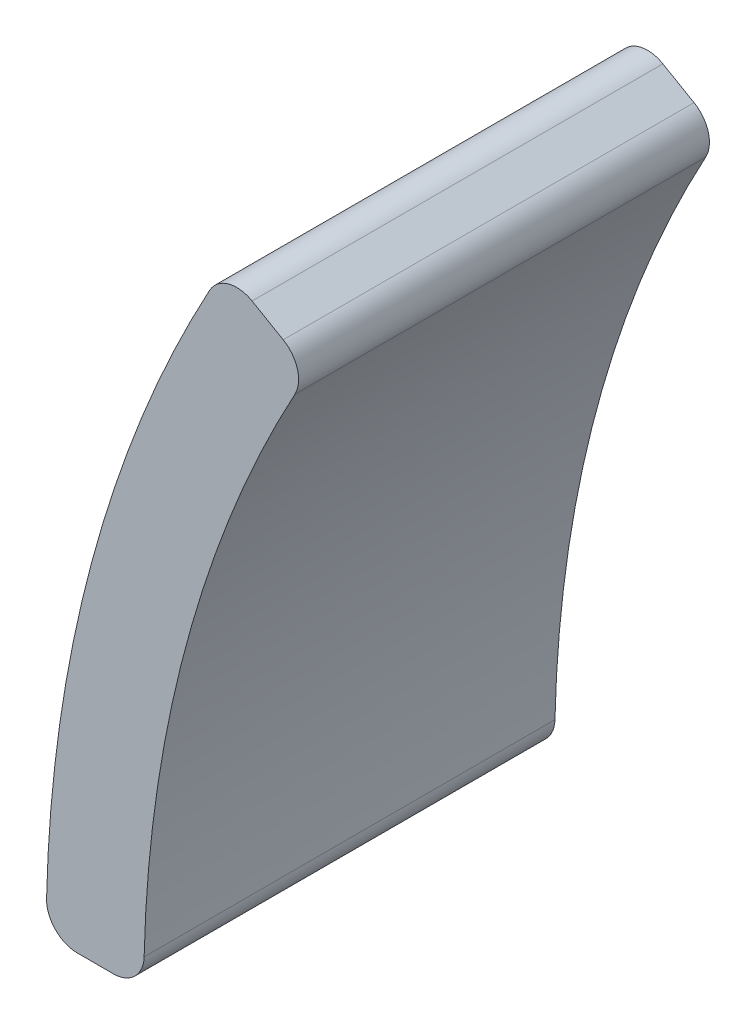
ISO-10303-21;
HEADER;
FILE_DESCRIPTION(('STEP AP214'),'2;1');
FILE_NAME('part.step','',(''),(''),'','','');
FILE_SCHEMA(('AUTOMOTIVE_DESIGN { 1 0 10303 214 1 1 1 1 }'));
ENDSEC;
DATA;
#1=APPLICATION_CONTEXT('core data for automotive mechanical design processes');
#2=APPLICATION_PROTOCOL_DEFINITION('international standard','automotive_design',2000,#1);
#3=PRODUCT_CONTEXT('',#1,'mechanical');
#4=PRODUCT('Part','Part','',(#3));
#5=PRODUCT_RELATED_PRODUCT_CATEGORY('part','',(#4));
#6=PRODUCT_DEFINITION_FORMATION('','',#4);
#7=PRODUCT_DEFINITION_CONTEXT('part definition',#1,'design');
#8=PRODUCT_DEFINITION('design','',#6,#7);
#9=PRODUCT_DEFINITION_SHAPE('','',#8);
#10=(LENGTH_UNIT() NAMED_UNIT(*) SI_UNIT(.MILLI.,.METRE.));
#11=(NAMED_UNIT(*) PLANE_ANGLE_UNIT() SI_UNIT($,.RADIAN.));
#12=(NAMED_UNIT(*) SI_UNIT($,.STERADIAN.) SOLID_ANGLE_UNIT());
#13=UNCERTAINTY_MEASURE_WITH_UNIT(LENGTH_MEASURE(1.E-05),#10,'distance_accuracy_value','');
#14=(GEOMETRIC_REPRESENTATION_CONTEXT(3) GLOBAL_UNCERTAINTY_ASSIGNED_CONTEXT((#13)) GLOBAL_UNIT_ASSIGNED_CONTEXT((#10,
#11,#12)) REPRESENTATION_CONTEXT('',''));
#15=CARTESIAN_POINT('',(0.,0.,0.));
#16=DIRECTION('',(0.,0.,1.));
#17=DIRECTION('',(1.,0.,0.));
#18=AXIS2_PLACEMENT_3D('',#15,#16,#17);
#19=CARTESIAN_POINT('',(0.,0.,40.));
#20=DIRECTION('',(-0.499999999999995,-0.866025403784442,0.));
#21=DIRECTION('',(0.866025403784442,-0.499999999999995,0.));
#22=AXIS2_PLACEMENT_3D('',#19,#20,#21);
#23=PLANE('',#22);
#24=DIRECTION('',(-0.866025403784442,0.499999999999995,0.));
#25=VECTOR('',#24,1.);
#26=CARTESIAN_POINT('',(0.,0.,0.));
#27=LINE('',#26,#25);
#28=CARTESIAN_POINT('',(-106.922577129435,61.7317786881272,0.));
#29=VERTEX_POINT('',#28);
#30=CARTESIAN_POINT('',(-109.954536059228,63.4822809924149,0.));
#31=VERTEX_POINT('',#30);
#32=EDGE_CURVE('E147',#29,#31,#27,.T.);
#33=ORIENTED_EDGE('',*,*,#32,.T.);
#34=DIRECTION('',(0.,0.,-1.));
#35=VECTOR('',#34,1.);
#36=CARTESIAN_POINT('',(-109.954536059228,63.4822809924149,40.));
#37=LINE('',#36,#35);
#38=CARTESIAN_POINT('',(-109.954536059228,63.4822809924149,40.));
#39=VERTEX_POINT('',#38);
#40=EDGE_CURVE('E11',#31,#39,#37,.F.);
#41=ORIENTED_EDGE('',*,*,#40,.T.);
#42=DIRECTION('',(-0.866025403784442,0.499999999999995,0.));
#43=VECTOR('',#42,1.);
#44=CARTESIAN_POINT('',(0.,0.,40.));
#45=LINE('',#44,#43);
#46=CARTESIAN_POINT('',(-106.922577129435,61.7317786881272,40.));
#47=VERTEX_POINT('',#46);
#48=EDGE_CURVE('E145',#47,#39,#45,.T.);
#49=ORIENTED_EDGE('',*,*,#48,.F.);
#50=DIRECTION('',(0.,0.,1.));
#51=VECTOR('',#50,1.);
#52=CARTESIAN_POINT('',(-106.922577129435,61.7317786881272,0.));
#53=LINE('',#52,#51);
#54=EDGE_CURVE('E54',#47,#29,#53,.F.);
#55=ORIENTED_EDGE('',*,*,#54,.T.);
#56=EDGE_LOOP('',(#33,#41,#49,#55));
#57=FACE_BOUND('',#56,.T.);
#58=ADVANCED_FACE('F45',(#57),#23,.F.);
#59=CARTESIAN_POINT('',(0.,0.,40.));
#60=DIRECTION('',(0.,0.,-1.));
#61=DIRECTION('',(-1.,0.,0.));
#62=AXIS2_PLACEMENT_3D('',#59,#60,#61);
#63=CYLINDRICAL_SURFACE('',#62,130.);
#64=CARTESIAN_POINT('',(0.,0.,0.));
#65=DIRECTION('',(0.,0.,1.));
#66=DIRECTION('',(1.,0.,0.));
#67=AXIS2_PLACEMENT_3D('',#64,#65,#66);
#68=CIRCLE('',#67,130.);
#69=CARTESIAN_POINT('',(-114.087320375588,62.3224143428189,0.));
#70=VERTEX_POINT('',#69);
#71=CARTESIAN_POINT('',(-129.963724866362,3.07086614173228,0.));
#72=VERTEX_POINT('',#71);
#73=EDGE_CURVE('E141',#70,#72,#68,.T.);
#74=ORIENTED_EDGE('',*,*,#73,.T.);
#75=DIRECTION('',(0.,0.,-1.));
#76=VECTOR('',#75,1.);
#77=CARTESIAN_POINT('',(-129.963724866362,3.07086614173228,40.));
#78=LINE('',#77,#76);
#79=CARTESIAN_POINT('',(-129.963724866362,3.07086614173228,40.));
#80=VERTEX_POINT('',#79);
#81=EDGE_CURVE('E117',#72,#80,#78,.F.);
#82=ORIENTED_EDGE('',*,*,#81,.T.);
#83=CARTESIAN_POINT('',(0.,0.,40.));
#84=DIRECTION('',(0.,0.,1.));
#85=DIRECTION('',(1.,0.,0.));
#86=AXIS2_PLACEMENT_3D('',#83,#84,#85);
#87=CIRCLE('',#86,130.);
#88=CARTESIAN_POINT('',(-114.087320375588,62.3224143428189,40.));
#89=VERTEX_POINT('',#88);
#90=EDGE_CURVE('E204',#89,#80,#87,.T.);
#91=ORIENTED_EDGE('',*,*,#90,.F.);
#92=DIRECTION('',(0.,0.,-1.));
#93=VECTOR('',#92,1.);
#94=CARTESIAN_POINT('',(-114.087320375588,62.3224143428189,40.));
#95=LINE('',#94,#93);
#96=EDGE_CURVE('E123',#89,#70,#95,.T.);
#97=ORIENTED_EDGE('',*,*,#96,.T.);
#98=EDGE_LOOP('',(#74,#82,#91,#97));
#99=FACE_BOUND('',#98,.T.);
#100=ADVANCED_FACE('F245',(#99),#63,.T.);
#101=CARTESIAN_POINT('',(0.,0.,40.));
#102=DIRECTION('',(0.,1.,0.));
#103=DIRECTION('',(0.,0.,1.));
#104=AXIS2_PLACEMENT_3D('',#101,#102,#103);
#105=PLANE('',#104);
#106=DIRECTION('',(1.,0.,0.));
#107=VECTOR('',#106,1.);
#108=CARTESIAN_POINT('',(0.,0.,40.));
#109=LINE('',#108,#107);
#110=CARTESIAN_POINT('',(-126.964561984831,0.,40.));
#111=VERTEX_POINT('',#110);
#112=CARTESIAN_POINT('',(-123.463557376256,0.,40.));
#113=VERTEX_POINT('',#112);
#114=EDGE_CURVE('E132',#111,#113,#109,.T.);
#115=ORIENTED_EDGE('',*,*,#114,.F.);
#116=DIRECTION('',(0.,0.,-1.));
#117=VECTOR('',#116,1.);
#118=CARTESIAN_POINT('',(-126.964561984831,0.,40.));
#119=LINE('',#118,#117);
#120=CARTESIAN_POINT('',(-126.964561984831,0.,0.));
#121=VERTEX_POINT('',#120);
#122=EDGE_CURVE('E116',#111,#121,#119,.T.);
#123=ORIENTED_EDGE('',*,*,#122,.T.);
#124=DIRECTION('',(1.,0.,0.));
#125=VECTOR('',#124,1.);
#126=CARTESIAN_POINT('',(0.,0.,0.));
#127=LINE('',#126,#125);
#128=CARTESIAN_POINT('',(-123.463557376256,0.,0.));
#129=VERTEX_POINT('',#128);
#130=EDGE_CURVE('E130',#121,#129,#127,.T.);
#131=ORIENTED_EDGE('',*,*,#130,.T.);
#132=DIRECTION('',(0.,0.,1.));
#133=VECTOR('',#132,1.);
#134=CARTESIAN_POINT('',(-123.463557376256,0.,40.));
#135=LINE('',#134,#133);
#136=EDGE_CURVE('E135',#129,#113,#135,.T.);
#137=ORIENTED_EDGE('',*,*,#136,.T.);
#138=EDGE_LOOP('',(#115,#123,#131,#137));
#139=FACE_BOUND('',#138,.T.);
#140=ADVANCED_FACE('F129',(#139),#105,.F.);
#141=CARTESIAN_POINT('',(0.,0.,40.));
#142=DIRECTION('',(0.,0.,-1.));
#143=DIRECTION('',(-1.,0.,0.));
#144=AXIS2_PLACEMENT_3D('',#141,#142,#143);
#145=CYLINDRICAL_SURFACE('',#144,120.5);
#146=CARTESIAN_POINT('',(0.,0.,40.));
#147=DIRECTION('',(0.,0.,1.));
#148=DIRECTION('',(1.,0.,0.));
#149=AXIS2_PLACEMENT_3D('',#146,#147,#148);
#150=CIRCLE('',#149,120.5);
#151=CARTESIAN_POINT('',(-105.788830316575,57.6972562627632,40.));
#152=VERTEX_POINT('',#151);
#153=CARTESIAN_POINT('',(-120.464442622177,2.92712550607287,40.));
#154=VERTEX_POINT('',#153);
#155=EDGE_CURVE('E152',#152,#154,#150,.T.);
#156=ORIENTED_EDGE('',*,*,#155,.T.);
#157=DIRECTION('',(0.,0.,-1.));
#158=VECTOR('',#157,1.);
#159=CARTESIAN_POINT('',(-120.464442622177,2.92712550607287,40.));
#160=LINE('',#159,#158);
#161=CARTESIAN_POINT('',(-120.464442622177,2.92712550607287,0.));
#162=VERTEX_POINT('',#161);
#163=EDGE_CURVE('E179',#154,#162,#160,.T.);
#164=ORIENTED_EDGE('',*,*,#163,.T.);
#165=CARTESIAN_POINT('',(0.,0.,0.));
#166=DIRECTION('',(0.,0.,1.));
#167=DIRECTION('',(1.,0.,0.));
#168=AXIS2_PLACEMENT_3D('',#165,#166,#167);
#169=CIRCLE('',#168,120.5);
#170=CARTESIAN_POINT('',(-105.788830316575,57.6972562627632,0.));
#171=VERTEX_POINT('',#170);
#172=EDGE_CURVE('E140',#171,#162,#169,.T.);
#173=ORIENTED_EDGE('',*,*,#172,.F.);
#174=DIRECTION('',(0.,0.,-1.));
#175=VECTOR('',#174,1.);
#176=CARTESIAN_POINT('',(-105.788830316575,57.6972562627632,40.));
#177=LINE('',#176,#175);
#178=EDGE_CURVE('E68',#171,#152,#177,.F.);
#179=ORIENTED_EDGE('',*,*,#178,.T.);
#180=EDGE_LOOP('',(#156,#164,#173,#179));
#181=FACE_BOUND('',#180,.T.);
#182=ADVANCED_FACE('F267',(#181),#145,.F.);
#183=CARTESIAN_POINT('',(0.,0.,40.));
#184=DIRECTION('',(0.,0.,1.));
#185=DIRECTION('',(1.,0.,0.));
#186=AXIS2_PLACEMENT_3D('',#183,#184,#185);
#187=PLANE('',#186);
#188=ORIENTED_EDGE('',*,*,#90,.T.);
#189=CARTESIAN_POINT('',(-126.964561984831,3.,40.));
#190=DIRECTION('',(0.,0.,1.));
#191=DIRECTION('',(1.,0.,0.));
#192=AXIS2_PLACEMENT_3D('',#189,#190,#191);
#193=CIRCLE('',#192,3.);
#194=EDGE_CURVE('E174',#80,#111,#193,.T.);
#195=ORIENTED_EDGE('',*,*,#194,.T.);
#196=ORIENTED_EDGE('',*,*,#114,.T.);
#197=CARTESIAN_POINT('',(-123.463557376256,3.,40.));
#198=DIRECTION('',(0.,0.,1.));
#199=DIRECTION('',(1.,0.,0.));
#200=AXIS2_PLACEMENT_3D('',#197,#198,#199);
#201=CIRCLE('',#200,3.);
#202=EDGE_CURVE('E61',#113,#154,#201,.T.);
#203=ORIENTED_EDGE('',*,*,#202,.T.);
#204=ORIENTED_EDGE('',*,*,#155,.F.);
#205=CARTESIAN_POINT('',(-108.422577129435,59.1337024767739,40.));
#206=DIRECTION('',(0.,0.,1.));
#207=DIRECTION('',(1.,0.,0.));
#208=AXIS2_PLACEMENT_3D('',#205,#206,#207);
#209=CIRCLE('',#208,3.);
#210=EDGE_CURVE('E166',#152,#47,#209,.T.);
#211=ORIENTED_EDGE('',*,*,#210,.T.);
#212=ORIENTED_EDGE('',*,*,#48,.T.);
#213=CARTESIAN_POINT('',(-111.454536059228,60.8842047810615,40.));
#214=DIRECTION('',(0.,0.,1.));
#215=DIRECTION('',(1.,0.,0.));
#216=AXIS2_PLACEMENT_3D('',#213,#214,#215);
#217=CIRCLE('',#216,3.);
#218=EDGE_CURVE('E169',#39,#89,#217,.T.);
#219=ORIENTED_EDGE('',*,*,#218,.T.);
#220=EDGE_LOOP('',(#188,#195,#196,#203,#204,#211,#212,#219));
#221=FACE_BOUND('',#220,.T.);
#222=ADVANCED_FACE('F226',(#221),#187,.T.);
#223=CARTESIAN_POINT('',(0.,0.,0.));
#224=DIRECTION('',(0.,0.,1.));
#225=DIRECTION('',(1.,0.,0.));
#226=AXIS2_PLACEMENT_3D('',#223,#224,#225);
#227=PLANE('',#226);
#228=CARTESIAN_POINT('',(-125.022434610514,10.9380457148303,0.));
#229=DIRECTION('',(0.,0.,-1.));
#230=DIRECTION('',(-1.,0.,0.));
#231=AXIS2_PLACEMENT_3D('',#228,#229,#230);
#232=CIRCLE('',#231,2.);
#233=CARTESIAN_POINT('',(-127.022434610514,10.9380457148303,0.));
#234=VERTEX_POINT('',#233);
#235=EDGE_CURVE('E197',#234,#234,#232,.T.);
#236=ORIENTED_EDGE('',*,*,#235,.F.);
#237=EDGE_LOOP('',(#236));
#238=FACE_BOUND('',#237,.T.);
#239=CARTESIAN_POINT('',(-113.7416272731,53.0385918484571,0.));
#240=DIRECTION('',(0.,0.,-1.));
#241=DIRECTION('',(-1.,0.,0.));
#242=AXIS2_PLACEMENT_3D('',#239,#240,#241);
#243=CIRCLE('',#242,2.);
#244=CARTESIAN_POINT('',(-115.7416272731,53.0385918484571,0.));
#245=VERTEX_POINT('',#244);
#246=EDGE_CURVE('E214',#245,#245,#243,.T.);
#247=ORIENTED_EDGE('',*,*,#246,.F.);
#248=EDGE_LOOP('',(#247));
#249=FACE_BOUND('',#248,.T.);
#250=ORIENTED_EDGE('',*,*,#130,.F.);
#251=CARTESIAN_POINT('',(-126.964561984831,3.,0.));
#252=DIRECTION('',(0.,0.,1.));
#253=DIRECTION('',(1.,0.,0.));
#254=AXIS2_PLACEMENT_3D('',#251,#252,#253);
#255=CIRCLE('',#254,3.);
#256=EDGE_CURVE('E112',#121,#72,#255,.F.);
#257=ORIENTED_EDGE('',*,*,#256,.T.);
#258=ORIENTED_EDGE('',*,*,#73,.F.);
#259=CARTESIAN_POINT('',(-111.454536059228,60.8842047810615,0.));
#260=DIRECTION('',(0.,0.,1.));
#261=DIRECTION('',(1.,0.,0.));
#262=AXIS2_PLACEMENT_3D('',#259,#260,#261);
#263=CIRCLE('',#262,3.);
#264=EDGE_CURVE('E156',#70,#31,#263,.F.);
#265=ORIENTED_EDGE('',*,*,#264,.T.);
#266=ORIENTED_EDGE('',*,*,#32,.F.);
#267=CARTESIAN_POINT('',(-108.422577129435,59.1337024767739,0.));
#268=DIRECTION('',(0.,0.,1.));
#269=DIRECTION('',(1.,0.,0.));
#270=AXIS2_PLACEMENT_3D('',#267,#268,#269);
#271=CIRCLE('',#270,3.);
#272=EDGE_CURVE('E134',#29,#171,#271,.F.);
#273=ORIENTED_EDGE('',*,*,#272,.T.);
#274=ORIENTED_EDGE('',*,*,#172,.T.);
#275=CARTESIAN_POINT('',(-123.463557376256,3.,0.));
#276=DIRECTION('',(0.,0.,1.));
#277=DIRECTION('',(1.,0.,0.));
#278=AXIS2_PLACEMENT_3D('',#275,#276,#277);
#279=CIRCLE('',#278,3.);
#280=EDGE_CURVE('E124',#162,#129,#279,.F.);
#281=ORIENTED_EDGE('',*,*,#280,.T.);
#282=EDGE_LOOP('',(#250,#257,#258,#265,#266,#273,#274,#281));
#283=FACE_BOUND('',#282,.T.);
#284=ADVANCED_FACE('F137',(#238,#249,#283),#227,.F.);
#285=CARTESIAN_POINT('',(-126.964561984831,3.,40.));
#286=DIRECTION('',(0.,0.,-1.));
#287=DIRECTION('',(-1.,0.,0.));
#288=AXIS2_PLACEMENT_3D('',#285,#286,#287);
#289=CYLINDRICAL_SURFACE('',#288,3.);
#290=ORIENTED_EDGE('',*,*,#194,.F.);
#291=ORIENTED_EDGE('',*,*,#81,.F.);
#292=ORIENTED_EDGE('',*,*,#256,.F.);
#293=ORIENTED_EDGE('',*,*,#122,.F.);
#294=EDGE_LOOP('',(#290,#291,#292,#293));
#295=FACE_BOUND('',#294,.T.);
#296=ADVANCED_FACE('F115',(#295),#289,.T.);
#297=CARTESIAN_POINT('',(-123.463557376256,3.,40.));
#298=DIRECTION('',(0.,0.,-1.));
#299=DIRECTION('',(-1.,0.,0.));
#300=AXIS2_PLACEMENT_3D('',#297,#298,#299);
#301=CYLINDRICAL_SURFACE('',#300,3.);
#302=ORIENTED_EDGE('',*,*,#202,.F.);
#303=ORIENTED_EDGE('',*,*,#136,.F.);
#304=ORIENTED_EDGE('',*,*,#280,.F.);
#305=ORIENTED_EDGE('',*,*,#163,.F.);
#306=EDGE_LOOP('',(#302,#303,#304,#305));
#307=FACE_BOUND('',#306,.T.);
#308=ADVANCED_FACE('F256',(#307),#301,.T.);
#309=CARTESIAN_POINT('',(-111.454536059228,60.8842047810615,40.));
#310=DIRECTION('',(0.,0.,-1.));
#311=DIRECTION('',(-1.,0.,0.));
#312=AXIS2_PLACEMENT_3D('',#309,#310,#311);
#313=CYLINDRICAL_SURFACE('',#312,3.);
#314=ORIENTED_EDGE('',*,*,#218,.F.);
#315=ORIENTED_EDGE('',*,*,#40,.F.);
#316=ORIENTED_EDGE('',*,*,#264,.F.);
#317=ORIENTED_EDGE('',*,*,#96,.F.);
#318=EDGE_LOOP('',(#314,#315,#316,#317));
#319=FACE_BOUND('',#318,.T.);
#320=ADVANCED_FACE('F241',(#319),#313,.T.);
#321=CARTESIAN_POINT('',(-108.422577129435,59.1337024767739,40.));
#322=DIRECTION('',(0.,0.,-1.));
#323=DIRECTION('',(-1.,0.,0.));
#324=AXIS2_PLACEMENT_3D('',#321,#322,#323);
#325=CYLINDRICAL_SURFACE('',#324,3.);
#326=ORIENTED_EDGE('',*,*,#210,.F.);
#327=ORIENTED_EDGE('',*,*,#178,.F.);
#328=ORIENTED_EDGE('',*,*,#272,.F.);
#329=ORIENTED_EDGE('',*,*,#54,.F.);
#330=EDGE_LOOP('',(#326,#327,#328,#329));
#331=FACE_BOUND('',#330,.T.);
#332=ADVANCED_FACE('F47',(#331),#325,.T.);
#333=CARTESIAN_POINT('',(-113.7416272731,53.0385918484571,10.));
#334=DIRECTION('',(0.,0.,-1.));
#335=DIRECTION('',(-1.,0.,0.));
#336=AXIS2_PLACEMENT_3D('',#333,#334,#335);
#337=CYLINDRICAL_SURFACE('',#336,2.);
#338=CARTESIAN_POINT('',(-113.7416272731,53.0385918484571,10.));
#339=DIRECTION('',(0.,0.,-1.));
#340=DIRECTION('',(-1.,0.,0.));
#341=AXIS2_PLACEMENT_3D('',#338,#339,#340);
#342=CIRCLE('',#341,2.);
#343=CARTESIAN_POINT('',(-115.7416272731,53.0385918484571,10.));
#344=VERTEX_POINT('',#343);
#345=EDGE_CURVE('E210',#344,#344,#342,.T.);
#346=ORIENTED_EDGE('',*,*,#345,.F.);
#347=EDGE_LOOP('',(#346));
#348=FACE_BOUND('',#347,.T.);
#349=ORIENTED_EDGE('',*,*,#246,.T.);
#350=EDGE_LOOP('',(#349));
#351=FACE_BOUND('',#350,.T.);
#352=ADVANCED_FACE('F230',(#348,#351),#337,.F.);
#353=CARTESIAN_POINT('',(-113.7416272731,53.0385918484571,10.));
#354=DIRECTION('',(0.,0.,-1.));
#355=DIRECTION('',(-1.,0.,0.));
#356=AXIS2_PLACEMENT_3D('',#353,#354,#355);
#357=PLANE('',#356);
#358=ORIENTED_EDGE('',*,*,#345,.T.);
#359=EDGE_LOOP('',(#358));
#360=FACE_BOUND('',#359,.T.);
#361=ADVANCED_FACE('F232',(#360),#357,.T.);
#362=CARTESIAN_POINT('',(-125.022434610514,10.9380457148303,10.));
#363=DIRECTION('',(0.,0.,-1.));
#364=DIRECTION('',(-1.,0.,0.));
#365=AXIS2_PLACEMENT_3D('',#362,#363,#364);
#366=CYLINDRICAL_SURFACE('',#365,2.);
#367=CARTESIAN_POINT('',(-125.022434610514,10.9380457148303,10.));
#368=DIRECTION('',(0.,0.,-1.));
#369=DIRECTION('',(-1.,0.,0.));
#370=AXIS2_PLACEMENT_3D('',#367,#368,#369);
#371=CIRCLE('',#370,2.);
#372=CARTESIAN_POINT('',(-127.022434610514,10.9380457148303,10.));
#373=VERTEX_POINT('',#372);
#374=EDGE_CURVE('E194',#373,#373,#371,.T.);
#375=ORIENTED_EDGE('',*,*,#374,.F.);
#376=EDGE_LOOP('',(#375));
#377=FACE_BOUND('',#376,.T.);
#378=ORIENTED_EDGE('',*,*,#235,.T.);
#379=EDGE_LOOP('',(#378));
#380=FACE_BOUND('',#379,.T.);
#381=ADVANCED_FACE('F222',(#377,#380),#366,.F.);
#382=CARTESIAN_POINT('',(-125.022434610514,10.9380457148303,10.));
#383=DIRECTION('',(0.,0.,-1.));
#384=DIRECTION('',(-1.,0.,0.));
#385=AXIS2_PLACEMENT_3D('',#382,#383,#384);
#386=PLANE('',#385);
#387=ORIENTED_EDGE('',*,*,#374,.T.);
#388=EDGE_LOOP('',(#387));
#389=FACE_BOUND('',#388,.T.);
#390=ADVANCED_FACE('F353',(#389),#386,.T.);
#391=CLOSED_SHELL('',(#58,#100,#140,#182,#222,#284,#296,#308,#320,#332,#352,#361,#381,#390));
#392=MANIFOLD_SOLID_BREP('B2',#391);
#393=ADVANCED_BREP_SHAPE_REPRESENTATION('',(#18,#392),#14);
#394=SHAPE_DEFINITION_REPRESENTATION(#9,#393);
ENDSEC;
END-ISO-10303-21;
